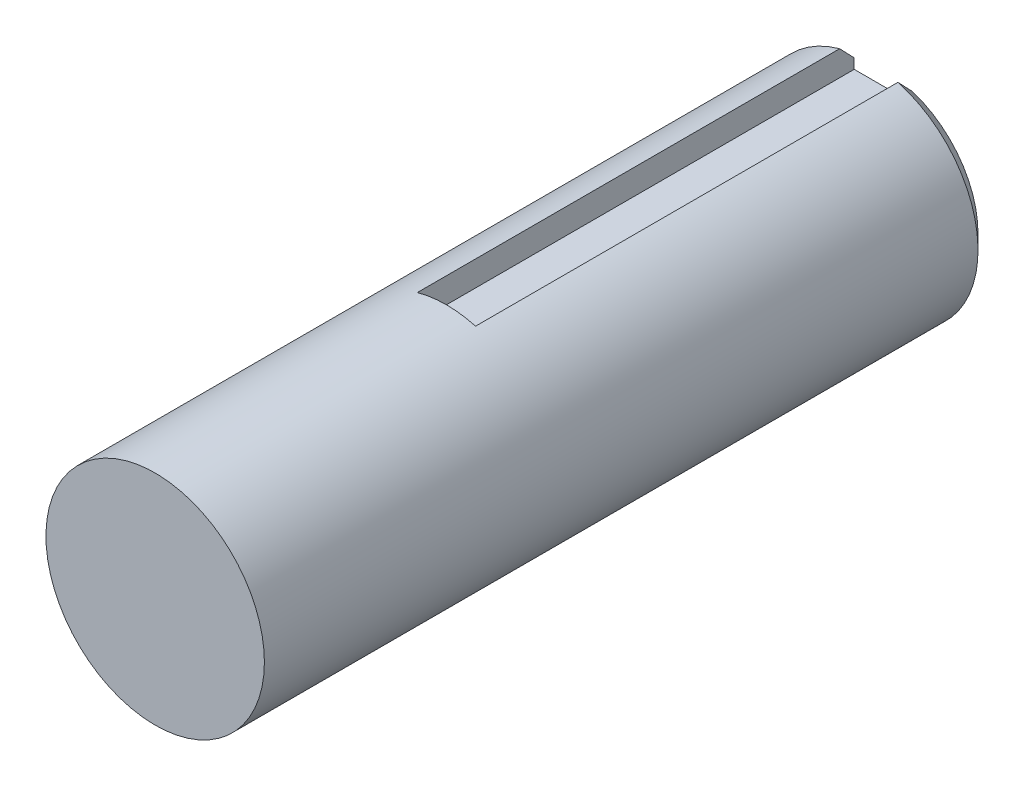
ISO-10303-21;
HEADER;
FILE_DESCRIPTION(('STEP AP214'),'2;1');
FILE_NAME('part.step','',(''),(''),'','','');
FILE_SCHEMA(('AUTOMOTIVE_DESIGN { 1 0 10303 214 1 1 1 1 }'));
ENDSEC;
DATA;
#1=APPLICATION_CONTEXT('core data for automotive mechanical design processes');
#2=APPLICATION_PROTOCOL_DEFINITION('international standard','automotive_design',2000,#1);
#3=PRODUCT_CONTEXT('',#1,'mechanical');
#4=PRODUCT('Part','Part','',(#3));
#5=PRODUCT_RELATED_PRODUCT_CATEGORY('part','',(#4));
#6=PRODUCT_DEFINITION_FORMATION('','',#4);
#7=PRODUCT_DEFINITION_CONTEXT('part definition',#1,'design');
#8=PRODUCT_DEFINITION('design','',#6,#7);
#9=PRODUCT_DEFINITION_SHAPE('','',#8);
#10=(LENGTH_UNIT() NAMED_UNIT(*) SI_UNIT(.MILLI.,.METRE.));
#11=(NAMED_UNIT(*) PLANE_ANGLE_UNIT() SI_UNIT($,.RADIAN.));
#12=(NAMED_UNIT(*) SI_UNIT($,.STERADIAN.) SOLID_ANGLE_UNIT());
#13=UNCERTAINTY_MEASURE_WITH_UNIT(LENGTH_MEASURE(1.E-05),#10,'distance_accuracy_value','');
#14=(GEOMETRIC_REPRESENTATION_CONTEXT(3) GLOBAL_UNCERTAINTY_ASSIGNED_CONTEXT((#13)) GLOBAL_UNIT_ASSIGNED_CONTEXT((#10,
#11,#12)) REPRESENTATION_CONTEXT('',''));
#15=CARTESIAN_POINT('',(0.,0.,0.));
#16=DIRECTION('',(0.,0.,1.));
#17=DIRECTION('',(1.,0.,0.));
#18=AXIS2_PLACEMENT_3D('',#15,#16,#17);
#19=CARTESIAN_POINT('',(0.,-0.169353065564366,75.3267892944387));
#20=DIRECTION('',(0.,0.,-1.));
#21=DIRECTION('',(-1.,0.,0.));
#22=AXIS2_PLACEMENT_3D('',#19,#20,#21);
#23=CYLINDRICAL_SURFACE('',#22,7.5);
#24=CARTESIAN_POINT('',(0.,-0.169353065564366,26.3267892944387));
#25=DIRECTION('',(0.,0.,1.));
#26=DIRECTION('',(1.,0.,0.));
#27=AXIS2_PLACEMENT_3D('',#24,#25,#26);
#28=CIRCLE('',#27,7.5);
#29=CARTESIAN_POINT('',(-2.,7.05906308183611,26.3267892944387));
#30=VERTEX_POINT('',#29);
#31=CARTESIAN_POINT('',(2.00000000000001,7.05906308183611,26.3267892944387));
#32=VERTEX_POINT('',#31);
#33=EDGE_CURVE('E138',#30,#32,#28,.T.);
#34=ORIENTED_EDGE('',*,*,#33,.T.);
#35=DIRECTION('',(0.,0.,-1.));
#36=VECTOR('',#35,1.);
#37=CARTESIAN_POINT('',(2.00000000000001,7.05906308183611,75.3267892944387));
#38=LINE('',#37,#36);
#39=CARTESIAN_POINT('',(2.00000000000001,7.05906308183611,55.3267892944387));
#40=VERTEX_POINT('',#39);
#41=EDGE_CURVE('E123',#32,#40,#38,.F.);
#42=ORIENTED_EDGE('',*,*,#41,.T.);
#43=CARTESIAN_POINT('',(0.,-0.169353065564366,55.3267892944387));
#44=DIRECTION('',(0.,0.,1.));
#45=DIRECTION('',(1.,0.,0.));
#46=AXIS2_PLACEMENT_3D('',#43,#44,#45);
#47=CIRCLE('',#46,7.5);
#48=CARTESIAN_POINT('',(-2.,7.05906308183611,55.3267892944387));
#49=VERTEX_POINT('',#48);
#50=EDGE_CURVE('E190',#40,#49,#47,.T.);
#51=ORIENTED_EDGE('',*,*,#50,.T.);
#52=DIRECTION('',(0.,0.,-1.));
#53=VECTOR('',#52,1.);
#54=CARTESIAN_POINT('',(-1.99999999999999,7.05906308183612,75.3267892944387));
#55=LINE('',#54,#53);
#56=EDGE_CURVE('E130',#49,#30,#55,.T.);
#57=ORIENTED_EDGE('',*,*,#56,.T.);
#58=EDGE_LOOP('',(#34,#42,#51,#57));
#59=FACE_BOUND('',#58,.T.);
#60=CARTESIAN_POINT('',(0.,-0.169353065564366,75.3267892944387));
#61=DIRECTION('',(0.,0.,1.));
#62=DIRECTION('',(1.,0.,0.));
#63=AXIS2_PLACEMENT_3D('',#60,#61,#62);
#64=CIRCLE('',#63,7.5);
#65=CARTESIAN_POINT('',(7.5,-0.169353065564366,75.3267892944387));
#66=VERTEX_POINT('',#65);
#67=EDGE_CURVE('E134',#66,#66,#64,.T.);
#68=ORIENTED_EDGE('',*,*,#67,.F.);
#69=EDGE_LOOP('',(#68));
#70=FACE_BOUND('',#69,.T.);
#71=ADVANCED_FACE('F38',(#59,#70),#23,.T.);
#72=CARTESIAN_POINT('',(0.,-0.169353065564366,75.3267892944387));
#73=DIRECTION('',(0.,0.,1.));
#74=DIRECTION('',(1.,0.,0.));
#75=AXIS2_PLACEMENT_3D('',#72,#73,#74);
#76=PLANE('',#75);
#77=ORIENTED_EDGE('',*,*,#67,.T.);
#78=EDGE_LOOP('',(#77));
#79=FACE_BOUND('',#78,.T.);
#80=ADVANCED_FACE('F173',(#79),#76,.T.);
#81=CARTESIAN_POINT('',(0.,-0.169353065564366,25.3267892944387));
#82=DIRECTION('',(0.,0.,1.));
#83=DIRECTION('',(1.,0.,0.));
#84=AXIS2_PLACEMENT_3D('',#81,#82,#83);
#85=PLANE('',#84);
#86=CARTESIAN_POINT('',(0.,-0.169353065564366,25.3267892944387));
#87=DIRECTION('',(0.,0.,1.));
#88=DIRECTION('',(1.,0.,0.));
#89=AXIS2_PLACEMENT_3D('',#86,#87,#88);
#90=CIRCLE('',#89,6.49999999999999);
#91=CARTESIAN_POINT('',(2.00000000000001,6.01530537286211,25.3267892944387));
#92=VERTEX_POINT('',#91);
#93=CARTESIAN_POINT('',(-2.,6.01530537286211,25.3267892944387));
#94=VERTEX_POINT('',#93);
#95=EDGE_CURVE('E142',#92,#94,#90,.F.);
#96=ORIENTED_EDGE('',*,*,#95,.T.);
#97=DIRECTION('',(0.,1.,0.));
#98=VECTOR('',#97,1.);
#99=CARTESIAN_POINT('',(-2.,5.33064693443563,25.3267892944387));
#100=LINE('',#99,#98);
#101=CARTESIAN_POINT('',(-2.,5.33064693443563,25.3267892944387));
#102=VERTEX_POINT('',#101);
#103=EDGE_CURVE('E111',#102,#94,#100,.T.);
#104=ORIENTED_EDGE('',*,*,#103,.F.);
#105=DIRECTION('',(-1.,0.,0.));
#106=VECTOR('',#105,1.);
#107=CARTESIAN_POINT('',(-2.,5.33064693443563,25.3267892944387));
#108=LINE('',#107,#106);
#109=CARTESIAN_POINT('',(2.00000000000001,5.33064693443563,25.3267892944387));
#110=VERTEX_POINT('',#109);
#111=EDGE_CURVE('E95',#110,#102,#108,.T.);
#112=ORIENTED_EDGE('',*,*,#111,.F.);
#113=DIRECTION('',(0.,1.,0.));
#114=VECTOR('',#113,1.);
#115=CARTESIAN_POINT('',(2.00000000000001,5.33064693443563,25.3267892944387));
#116=LINE('',#115,#114);
#117=EDGE_CURVE('E103',#110,#92,#116,.T.);
#118=ORIENTED_EDGE('',*,*,#117,.T.);
#119=EDGE_LOOP('',(#96,#104,#112,#118));
#120=FACE_BOUND('',#119,.T.);
#121=ADVANCED_FACE('F114',(#120),#85,.F.);
#122=CARTESIAN_POINT('',(0.,-0.169353065564366,26.3267892944387));
#123=DIRECTION('',(0.,0.,1.));
#124=DIRECTION('',(1.,0.,0.));
#125=AXIS2_PLACEMENT_3D('',#122,#123,#124);
#126=CONICAL_SURFACE('',#125,7.5,0.785398163397451);
#127=CARTESIAN_POINT('',(-2.,2.89314548961161,22.4845068068302));
#128=CARTESIAN_POINT('',(-2.,2.96413158713696,22.5439469453235));
#129=CARTESIAN_POINT('',(-2.,3.03481825716138,22.6037424733943));
#130=CARTESIAN_POINT('',(-2.,3.17566847938264,22.7239436999554));
#131=CARTESIAN_POINT('',(-2.,3.24583204288823,22.7843493851882));
#132=CARTESIAN_POINT('',(-2.,3.45564470145361,22.9663246292462));
#133=CARTESIAN_POINT('',(-2.,3.59462747970671,23.0886622403605));
#134=CARTESIAN_POINT('',(-2.,3.8712248030858,23.3348155516191));
#135=CARTESIAN_POINT('',(-2.,4.00883961222018,23.4586309559946));
#136=CARTESIAN_POINT('',(-2.,4.28303393339061,23.7074081744311));
#137=CARTESIAN_POINT('',(-2.,4.41961342022184,23.8323700162392));
#138=CARTESIAN_POINT('',(-2.,4.82806159007487,24.2084989419043));
#139=CARTESIAN_POINT('',(-2.,5.09871904747531,24.4609803747779));
#140=CARTESIAN_POINT('',(-2.,5.63795947436675,24.9681723071886));
#141=CARTESIAN_POINT('',(-2.,5.90654232213892,25.2228829356722));
#142=CARTESIAN_POINT('',(-2.,6.44218217048758,25.7337365021751));
#143=CARTESIAN_POINT('',(-2.,6.70923961866501,25.9898789712338));
#144=CARTESIAN_POINT('',(-2.,7.24231642879863,26.5032276805544));
#145=CARTESIAN_POINT('',(-2.,7.5083358160635,26.7604338945625));
#146=CARTESIAN_POINT('',(-2.,8.03967754591342,27.2756920006427));
#147=CARTESIAN_POINT('',(-2.,8.30499970622329,27.5337440805661));
#148=CARTESIAN_POINT('',(-2.,8.83505411409028,28.0504521619004));
#149=CARTESIAN_POINT('',(-2.,9.09978636316303,28.3091081617563));
#150=CARTESIAN_POINT('',(-2.,9.36430990885672,28.5679765788434));
#151=B_SPLINE_CURVE_WITH_KNOTS('',3,(#127,#128,#129,#130,#131,#132,#133,#134,#135,#136,#137,
#138,#139,#140,#141,#142,#143,#144,#145,#146,#147,#148,#149,#150),.UNSPECIFIED.,.F.,.F.,(4,2,2,
2,2,2,2,2,2,2,2,4),(0.,0.277754512029427,0.555503001924742,1.11095404264741,1.66629571861652,
2.22165087118451,3.33204251228678,4.44249881343912,5.55261054707443,6.66269504411023,
7.77304550606073,8.88339311196591),.UNSPECIFIED.);
#152=EDGE_CURVE('E152',#94,#30,#151,.T.);
#153=ORIENTED_EDGE('',*,*,#152,.F.);
#154=ORIENTED_EDGE('',*,*,#95,.F.);
#155=CARTESIAN_POINT('',(2.00000000000001,9.36430990885672,28.5679765788434));
#156=CARTESIAN_POINT('',(2.00000000000001,9.09978636316303,28.3091081617563));
#157=CARTESIAN_POINT('',(2.00000000000001,8.83505411409028,28.0504521619005));
#158=CARTESIAN_POINT('',(2.00000000000001,8.30499970622329,27.5337440805661));
#159=CARTESIAN_POINT('',(2.00000000000001,8.03967754591342,27.2756920006427));
#160=CARTESIAN_POINT('',(2.00000000000001,7.50833581606351,26.7604338945625));
#161=CARTESIAN_POINT('',(2.00000000000001,7.24231642879863,26.5032276805544));
#162=CARTESIAN_POINT('',(2.00000000000001,6.70923961866501,25.9898789712338));
#163=CARTESIAN_POINT('',(2.00000000000001,6.44218217048758,25.7337365021751));
#164=CARTESIAN_POINT('',(2.00000000000001,5.90654232213892,25.2228829356722));
#165=CARTESIAN_POINT('',(2.00000000000001,5.63795947436675,24.9681723071887));
#166=CARTESIAN_POINT('',(2.00000000000001,5.0987190474753,24.4609803747779));
#167=CARTESIAN_POINT('',(2.00000000000001,4.82806159007487,24.2084989419043));
#168=CARTESIAN_POINT('',(2.00000000000001,4.41961342022183,23.8323700162392));
#169=CARTESIAN_POINT('',(2.00000000000001,4.2830339333906,23.7074081744311));
#170=CARTESIAN_POINT('',(2.00000000000001,4.00883961222017,23.4586309559946));
#171=CARTESIAN_POINT('',(2.00000000000001,3.87122480308579,23.3348155516191));
#172=CARTESIAN_POINT('',(2.00000000000001,3.5946274797067,23.0886622403605));
#173=CARTESIAN_POINT('',(2.00000000000001,3.4556447014536,22.9663246292462));
#174=CARTESIAN_POINT('',(2.00000000000001,3.24583204288823,22.7843493851882));
#175=CARTESIAN_POINT('',(2.00000000000001,3.17566847938264,22.7239436999554));
#176=CARTESIAN_POINT('',(2.00000000000001,3.03481825716138,22.6037424733943));
#177=CARTESIAN_POINT('',(2.00000000000001,2.96413158713696,22.5439469453235));
#178=CARTESIAN_POINT('',(2.00000000000001,2.89314548961161,22.4845068068302));
#179=B_SPLINE_CURVE_WITH_KNOTS('',3,(#155,#156,#157,#158,#159,#160,#161,#162,#163,#164,#165,
#166,#167,#168,#169,#170,#171,#172,#173,#174,#175,#176,#177,#178),.UNSPECIFIED.,.F.,.F.,(4,2,2,
2,2,2,2,2,2,2,2,4),(0.,1.11034760590517,2.22069806785568,3.33078256489148,4.44089429852679,
5.55135059967913,6.6617422407814,7.2170973933494,7.7724390693185,8.32789011004117,
8.60563859993648,8.88339311196591),.UNSPECIFIED.);
#180=EDGE_CURVE('E106',#32,#92,#179,.T.);
#181=ORIENTED_EDGE('',*,*,#180,.F.);
#182=ORIENTED_EDGE('',*,*,#33,.F.);
#183=EDGE_LOOP('',(#153,#154,#181,#182));
#184=FACE_BOUND('',#183,.T.);
#185=ADVANCED_FACE('F159',(#184),#126,.T.);
#186=CARTESIAN_POINT('',(-2.,5.33064693443563,55.3267892944387));
#187=DIRECTION('',(0.,0.,1.));
#188=DIRECTION('',(1.,0.,0.));
#189=AXIS2_PLACEMENT_3D('',#186,#187,#188);
#190=PLANE('',#189);
#191=DIRECTION('',(0.,1.,0.));
#192=VECTOR('',#191,1.);
#193=CARTESIAN_POINT('',(2.00000000000001,5.33064693443563,55.3267892944387));
#194=LINE('',#193,#192);
#195=CARTESIAN_POINT('',(2.00000000000001,6.83064693443563,55.3267892944387));
#196=VERTEX_POINT('',#195);
#197=EDGE_CURVE('E112',#196,#40,#194,.T.);
#198=ORIENTED_EDGE('',*,*,#197,.F.);
#199=DIRECTION('',(1.,0.,0.));
#200=VECTOR('',#199,1.);
#201=CARTESIAN_POINT('',(-2.,6.83064693443563,55.3267892944387));
#202=LINE('',#201,#200);
#203=CARTESIAN_POINT('',(-2.,6.83064693443563,55.3267892944387));
#204=VERTEX_POINT('',#203);
#205=EDGE_CURVE('E47',#196,#204,#202,.F.);
#206=ORIENTED_EDGE('',*,*,#205,.T.);
#207=DIRECTION('',(0.,1.,0.));
#208=VECTOR('',#207,1.);
#209=CARTESIAN_POINT('',(-2.,5.33064693443563,55.3267892944387));
#210=LINE('',#209,#208);
#211=EDGE_CURVE('E116',#204,#49,#210,.T.);
#212=ORIENTED_EDGE('',*,*,#211,.T.);
#213=ORIENTED_EDGE('',*,*,#50,.F.);
#214=EDGE_LOOP('',(#198,#206,#212,#213));
#215=FACE_BOUND('',#214,.T.);
#216=ADVANCED_FACE('F167',(#215),#190,.F.);
#217=CARTESIAN_POINT('',(-2.,5.33064693443563,25.3267892944387));
#218=DIRECTION('',(-1.,0.,0.));
#219=DIRECTION('',(0.,0.,1.));
#220=AXIS2_PLACEMENT_3D('',#217,#218,#219);
#221=PLANE('',#220);
#222=ORIENTED_EDGE('',*,*,#211,.F.);
#223=CARTESIAN_POINT('',(-2.,6.83064693443563,53.8267892944387));
#224=DIRECTION('',(-1.,0.,0.));
#225=DIRECTION('',(0.,0.,1.));
#226=AXIS2_PLACEMENT_3D('',#223,#224,#225);
#227=CIRCLE('',#226,1.5);
#228=CARTESIAN_POINT('',(-2.,5.33064693443563,53.8267892944387));
#229=VERTEX_POINT('',#228);
#230=EDGE_CURVE('E11',#204,#229,#227,.F.);
#231=ORIENTED_EDGE('',*,*,#230,.T.);
#232=DIRECTION('',(0.,0.,1.));
#233=VECTOR('',#232,1.);
#234=CARTESIAN_POINT('',(-2.,5.33064693443563,25.3267892944387));
#235=LINE('',#234,#233);
#236=EDGE_CURVE('E100',#102,#229,#235,.T.);
#237=ORIENTED_EDGE('',*,*,#236,.F.);
#238=ORIENTED_EDGE('',*,*,#103,.T.);
#239=ORIENTED_EDGE('',*,*,#152,.T.);
#240=ORIENTED_EDGE('',*,*,#56,.F.);
#241=EDGE_LOOP('',(#222,#231,#237,#238,#239,#240));
#242=FACE_BOUND('',#241,.T.);
#243=ADVANCED_FACE('F166',(#242),#221,.F.);
#244=CARTESIAN_POINT('',(2.00000000000001,5.33064693443563,25.3267892944387));
#245=DIRECTION('',(1.,0.,0.));
#246=DIRECTION('',(0.,0.,-1.));
#247=AXIS2_PLACEMENT_3D('',#244,#245,#246);
#248=PLANE('',#247);
#249=DIRECTION('',(0.,0.,-1.));
#250=VECTOR('',#249,1.);
#251=CARTESIAN_POINT('',(2.00000000000001,5.33064693443563,25.3267892944387));
#252=LINE('',#251,#250);
#253=CARTESIAN_POINT('',(2.00000000000001,5.33064693443563,53.8267892944387));
#254=VERTEX_POINT('',#253);
#255=EDGE_CURVE('E90',#254,#110,#252,.T.);
#256=ORIENTED_EDGE('',*,*,#255,.F.);
#257=CARTESIAN_POINT('',(2.00000000000001,6.83064693443563,53.8267892944387));
#258=DIRECTION('',(1.,0.,0.));
#259=DIRECTION('',(0.,0.,-1.));
#260=AXIS2_PLACEMENT_3D('',#257,#258,#259);
#261=CIRCLE('',#260,1.5);
#262=EDGE_CURVE('E61',#254,#196,#261,.F.);
#263=ORIENTED_EDGE('',*,*,#262,.T.);
#264=ORIENTED_EDGE('',*,*,#197,.T.);
#265=ORIENTED_EDGE('',*,*,#41,.F.);
#266=ORIENTED_EDGE('',*,*,#180,.T.);
#267=ORIENTED_EDGE('',*,*,#117,.F.);
#268=EDGE_LOOP('',(#256,#263,#264,#265,#266,#267));
#269=FACE_BOUND('',#268,.T.);
#270=ADVANCED_FACE('F104',(#269),#248,.F.);
#271=CARTESIAN_POINT('',(0.,5.33064693443563,25.3267892944387));
#272=DIRECTION('',(0.,1.,0.));
#273=DIRECTION('',(0.,0.,1.));
#274=AXIS2_PLACEMENT_3D('',#271,#272,#273);
#275=PLANE('',#274);
#276=ORIENTED_EDGE('',*,*,#236,.T.);
#277=DIRECTION('',(1.,0.,0.));
#278=VECTOR('',#277,1.);
#279=CARTESIAN_POINT('',(0.,5.33064693443563,53.8267892944387));
#280=LINE('',#279,#278);
#281=EDGE_CURVE('E98',#229,#254,#280,.T.);
#282=ORIENTED_EDGE('',*,*,#281,.T.);
#283=ORIENTED_EDGE('',*,*,#255,.T.);
#284=ORIENTED_EDGE('',*,*,#111,.T.);
#285=EDGE_LOOP('',(#276,#282,#283,#284));
#286=FACE_BOUND('',#285,.T.);
#287=ADVANCED_FACE('F93',(#286),#275,.T.);
#288=CARTESIAN_POINT('',(0.,6.83064693443563,53.8267892944387));
#289=DIRECTION('',(1.,0.,0.));
#290=DIRECTION('',(0.,0.,-1.));
#291=AXIS2_PLACEMENT_3D('',#288,#289,#290);
#292=CYLINDRICAL_SURFACE('',#291,1.5);
#293=ORIENTED_EDGE('',*,*,#230,.F.);
#294=ORIENTED_EDGE('',*,*,#205,.F.);
#295=ORIENTED_EDGE('',*,*,#262,.F.);
#296=ORIENTED_EDGE('',*,*,#281,.F.);
#297=EDGE_LOOP('',(#293,#294,#295,#296));
#298=FACE_BOUND('',#297,.T.);
#299=ADVANCED_FACE('F40',(#298),#292,.F.);
#300=CLOSED_SHELL('',(#71,#80,#121,#185,#216,#243,#270,#287,#299));
#301=MANIFOLD_SOLID_BREP('B2',#300);
#302=ADVANCED_BREP_SHAPE_REPRESENTATION('',(#18,#301),#14);
#303=SHAPE_DEFINITION_REPRESENTATION(#9,#302);
ENDSEC;
END-ISO-10303-21;
